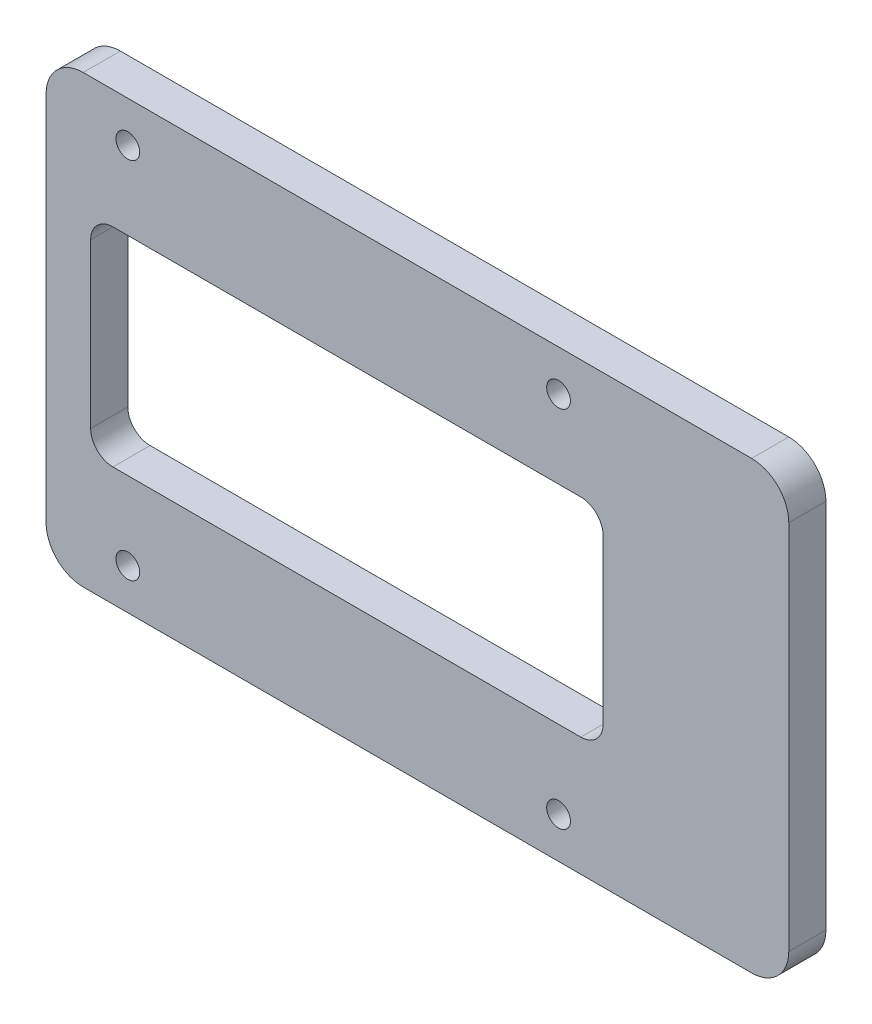
ISO-10303-21;
HEADER;
FILE_DESCRIPTION(('STEP AP214'),'2;1');
FILE_NAME('part.step','',(''),(''),'','','');
FILE_SCHEMA(('AUTOMOTIVE_DESIGN { 1 0 10303 214 1 1 1 1 }'));
ENDSEC;
DATA;
#1=APPLICATION_CONTEXT('core data for automotive mechanical design processes');
#2=APPLICATION_PROTOCOL_DEFINITION('international standard','automotive_design',2000,#1);
#3=PRODUCT_CONTEXT('',#1,'mechanical');
#4=PRODUCT('Part','Part','',(#3));
#5=PRODUCT_RELATED_PRODUCT_CATEGORY('part','',(#4));
#6=PRODUCT_DEFINITION_FORMATION('','',#4);
#7=PRODUCT_DEFINITION_CONTEXT('part definition',#1,'design');
#8=PRODUCT_DEFINITION('design','',#6,#7);
#9=PRODUCT_DEFINITION_SHAPE('','',#8);
#10=(LENGTH_UNIT() NAMED_UNIT(*) SI_UNIT(.MILLI.,.METRE.));
#11=(NAMED_UNIT(*) PLANE_ANGLE_UNIT() SI_UNIT($,.RADIAN.));
#12=(NAMED_UNIT(*) SI_UNIT($,.STERADIAN.) SOLID_ANGLE_UNIT());
#13=UNCERTAINTY_MEASURE_WITH_UNIT(LENGTH_MEASURE(1.E-05),#10,'distance_accuracy_value','');
#14=(GEOMETRIC_REPRESENTATION_CONTEXT(3) GLOBAL_UNCERTAINTY_ASSIGNED_CONTEXT((#13)) GLOBAL_UNIT_ASSIGNED_CONTEXT((#10,
#11,#12)) REPRESENTATION_CONTEXT('',''));
#15=CARTESIAN_POINT('',(0.,0.,0.));
#16=DIRECTION('',(0.,0.,1.));
#17=DIRECTION('',(1.,0.,0.));
#18=AXIS2_PLACEMENT_3D('',#15,#16,#17);
#19=CARTESIAN_POINT('',(-45.,-25.,5.));
#20=DIRECTION('',(0.,0.,1.));
#21=DIRECTION('',(1.,0.,0.));
#22=AXIS2_PLACEMENT_3D('',#19,#20,#21);
#23=PLANE('',#22);
#24=CARTESIAN_POINT('',(-39.,-24.5,5.));
#25=DIRECTION('',(0.,0.,1.));
#26=DIRECTION('',(1.,0.,0.));
#27=AXIS2_PLACEMENT_3D('',#24,#25,#26);
#28=CIRCLE('',#27,1.6);
#29=CARTESIAN_POINT('',(-37.4,-24.5,5.));
#30=VERTEX_POINT('',#29);
#31=EDGE_CURVE('E253',#30,#30,#28,.T.);
#32=ORIENTED_EDGE('',*,*,#31,.F.);
#33=EDGE_LOOP('',(#32));
#34=FACE_BOUND('',#33,.T.);
#35=CARTESIAN_POINT('',(19.,24.5,5.));
#36=DIRECTION('',(0.,0.,1.));
#37=DIRECTION('',(1.,0.,0.));
#38=AXIS2_PLACEMENT_3D('',#35,#36,#37);
#39=CIRCLE('',#38,1.6);
#40=CARTESIAN_POINT('',(20.6,24.5,5.));
#41=VERTEX_POINT('',#40);
#42=EDGE_CURVE('E269',#41,#41,#39,.T.);
#43=ORIENTED_EDGE('',*,*,#42,.F.);
#44=EDGE_LOOP('',(#43));
#45=FACE_BOUND('',#44,.T.);
#46=CARTESIAN_POINT('',(-45.,-25.,5.));
#47=DIRECTION('',(0.,0.,1.));
#48=DIRECTION('',(1.,0.,0.));
#49=AXIS2_PLACEMENT_3D('',#46,#47,#48);
#50=CIRCLE('',#49,5.);
#51=CARTESIAN_POINT('',(-50.,-25.,5.));
#52=VERTEX_POINT('',#51);
#53=CARTESIAN_POINT('',(-45.,-30.,5.));
#54=VERTEX_POINT('',#53);
#55=EDGE_CURVE('E277',#52,#54,#50,.T.);
#56=ORIENTED_EDGE('',*,*,#55,.T.);
#57=DIRECTION('',(1.,0.,0.));
#58=VECTOR('',#57,1.);
#59=CARTESIAN_POINT('',(-45.,-30.,5.));
#60=LINE('',#59,#58);
#61=CARTESIAN_POINT('',(45.,-30.,5.));
#62=VERTEX_POINT('',#61);
#63=EDGE_CURVE('E281',#54,#62,#60,.T.);
#64=ORIENTED_EDGE('',*,*,#63,.T.);
#65=CARTESIAN_POINT('',(45.,-25.,5.));
#66=DIRECTION('',(0.,0.,1.));
#67=DIRECTION('',(1.,0.,0.));
#68=AXIS2_PLACEMENT_3D('',#65,#66,#67);
#69=CIRCLE('',#68,5.);
#70=CARTESIAN_POINT('',(50.,-25.,5.));
#71=VERTEX_POINT('',#70);
#72=EDGE_CURVE('E285',#62,#71,#69,.T.);
#73=ORIENTED_EDGE('',*,*,#72,.T.);
#74=DIRECTION('',(0.,1.,0.));
#75=VECTOR('',#74,1.);
#76=CARTESIAN_POINT('',(50.,25.,5.));
#77=LINE('',#76,#75);
#78=CARTESIAN_POINT('',(50.,25.,5.));
#79=VERTEX_POINT('',#78);
#80=EDGE_CURVE('E288',#71,#79,#77,.T.);
#81=ORIENTED_EDGE('',*,*,#80,.T.);
#82=CARTESIAN_POINT('',(45.,25.,5.));
#83=DIRECTION('',(0.,0.,1.));
#84=DIRECTION('',(-1.,0.,0.));
#85=AXIS2_PLACEMENT_3D('',#82,#83,#84);
#86=CIRCLE('',#85,5.);
#87=CARTESIAN_POINT('',(45.,30.,5.));
#88=VERTEX_POINT('',#87);
#89=EDGE_CURVE('E291',#79,#88,#86,.T.);
#90=ORIENTED_EDGE('',*,*,#89,.T.);
#91=DIRECTION('',(-1.,0.,0.));
#92=VECTOR('',#91,1.);
#93=CARTESIAN_POINT('',(-45.,30.,5.));
#94=LINE('',#93,#92);
#95=CARTESIAN_POINT('',(-45.,30.,5.));
#96=VERTEX_POINT('',#95);
#97=EDGE_CURVE('E294',#88,#96,#94,.T.);
#98=ORIENTED_EDGE('',*,*,#97,.T.);
#99=CARTESIAN_POINT('',(-45.,25.,5.));
#100=DIRECTION('',(0.,0.,1.));
#101=DIRECTION('',(1.,0.,0.));
#102=AXIS2_PLACEMENT_3D('',#99,#100,#101);
#103=CIRCLE('',#102,5.);
#104=CARTESIAN_POINT('',(-50.,25.,5.));
#105=VERTEX_POINT('',#104);
#106=EDGE_CURVE('E297',#96,#105,#103,.T.);
#107=ORIENTED_EDGE('',*,*,#106,.T.);
#108=DIRECTION('',(0.,-1.,0.));
#109=VECTOR('',#108,1.);
#110=CARTESIAN_POINT('',(-50.,25.,5.));
#111=LINE('',#110,#109);
#112=EDGE_CURVE('E300',#105,#52,#111,.T.);
#113=ORIENTED_EDGE('',*,*,#112,.T.);
#114=EDGE_LOOP('',(#56,#64,#73,#81,#90,#98,#107,#113));
#115=FACE_BOUND('',#114,.T.);
#116=CARTESIAN_POINT('',(19.,-24.5,5.));
#117=DIRECTION('',(0.,0.,1.));
#118=DIRECTION('',(1.,0.,0.));
#119=AXIS2_PLACEMENT_3D('',#116,#117,#118);
#120=CIRCLE('',#119,1.6);
#121=CARTESIAN_POINT('',(20.6,-24.5,5.));
#122=VERTEX_POINT('',#121);
#123=EDGE_CURVE('E261',#122,#122,#120,.T.);
#124=ORIENTED_EDGE('',*,*,#123,.F.);
#125=EDGE_LOOP('',(#124));
#126=FACE_BOUND('',#125,.T.);
#127=CARTESIAN_POINT('',(-39.,24.5,5.));
#128=DIRECTION('',(0.,0.,1.));
#129=DIRECTION('',(1.,0.,0.));
#130=AXIS2_PLACEMENT_3D('',#127,#128,#129);
#131=CIRCLE('',#130,1.6);
#132=CARTESIAN_POINT('',(-37.4,24.5,5.));
#133=VERTEX_POINT('',#132);
#134=EDGE_CURVE('E245',#133,#133,#131,.T.);
#135=ORIENTED_EDGE('',*,*,#134,.F.);
#136=EDGE_LOOP('',(#135));
#137=FACE_BOUND('',#136,.T.);
#138=DIRECTION('',(0.,1.,0.));
#139=VECTOR('',#138,1.);
#140=CARTESIAN_POINT('',(25.,11.,5.));
#141=LINE('',#140,#139);
#142=CARTESIAN_POINT('',(25.,-11.,5.));
#143=VERTEX_POINT('',#142);
#144=CARTESIAN_POINT('',(25.,11.,5.));
#145=VERTEX_POINT('',#144);
#146=EDGE_CURVE('E165',#143,#145,#141,.T.);
#147=ORIENTED_EDGE('',*,*,#146,.F.);
#148=CARTESIAN_POINT('',(22.,-11.,5.));
#149=DIRECTION('',(0.,0.,1.));
#150=DIRECTION('',(1.,0.,0.));
#151=AXIS2_PLACEMENT_3D('',#148,#149,#150);
#152=CIRCLE('',#151,3.);
#153=CARTESIAN_POINT('',(22.,-14.,5.));
#154=VERTEX_POINT('',#153);
#155=EDGE_CURVE('E156',#154,#143,#152,.T.);
#156=ORIENTED_EDGE('',*,*,#155,.F.);
#157=DIRECTION('',(1.,0.,0.));
#158=VECTOR('',#157,1.);
#159=CARTESIAN_POINT('',(-41.,-14.,5.));
#160=LINE('',#159,#158);
#161=CARTESIAN_POINT('',(-41.,-14.,5.));
#162=VERTEX_POINT('',#161);
#163=EDGE_CURVE('E197',#162,#154,#160,.T.);
#164=ORIENTED_EDGE('',*,*,#163,.F.);
#165=CARTESIAN_POINT('',(-41.,-11.,5.));
#166=DIRECTION('',(0.,0.,1.));
#167=DIRECTION('',(1.,0.,0.));
#168=AXIS2_PLACEMENT_3D('',#165,#166,#167);
#169=CIRCLE('',#168,3.);
#170=CARTESIAN_POINT('',(-44.,-11.,5.));
#171=VERTEX_POINT('',#170);
#172=EDGE_CURVE('E194',#171,#162,#169,.T.);
#173=ORIENTED_EDGE('',*,*,#172,.F.);
#174=DIRECTION('',(0.,-1.,0.));
#175=VECTOR('',#174,1.);
#176=CARTESIAN_POINT('',(-44.,11.,5.));
#177=LINE('',#176,#175);
#178=CARTESIAN_POINT('',(-44.,11.,5.));
#179=VERTEX_POINT('',#178);
#180=EDGE_CURVE('E191',#179,#171,#177,.T.);
#181=ORIENTED_EDGE('',*,*,#180,.F.);
#182=CARTESIAN_POINT('',(-41.,11.,5.));
#183=DIRECTION('',(0.,0.,1.));
#184=DIRECTION('',(1.,0.,0.));
#185=AXIS2_PLACEMENT_3D('',#182,#183,#184);
#186=CIRCLE('',#185,3.);
#187=CARTESIAN_POINT('',(-41.,14.,5.));
#188=VERTEX_POINT('',#187);
#189=EDGE_CURVE('E188',#188,#179,#186,.T.);
#190=ORIENTED_EDGE('',*,*,#189,.F.);
#191=DIRECTION('',(-1.,0.,0.));
#192=VECTOR('',#191,1.);
#193=CARTESIAN_POINT('',(-41.,14.,5.));
#194=LINE('',#193,#192);
#195=CARTESIAN_POINT('',(22.,14.,5.));
#196=VERTEX_POINT('',#195);
#197=EDGE_CURVE('E183',#196,#188,#194,.T.);
#198=ORIENTED_EDGE('',*,*,#197,.F.);
#199=CARTESIAN_POINT('',(22.,11.,5.));
#200=DIRECTION('',(0.,0.,1.));
#201=DIRECTION('',(-1.,0.,0.));
#202=AXIS2_PLACEMENT_3D('',#199,#200,#201);
#203=CIRCLE('',#202,3.);
#204=EDGE_CURVE('E179',#145,#196,#203,.T.);
#205=ORIENTED_EDGE('',*,*,#204,.F.);
#206=EDGE_LOOP('',(#147,#156,#164,#173,#181,#190,#198,#205));
#207=FACE_BOUND('',#206,.T.);
#208=ADVANCED_FACE('F42',(#34,#45,#115,#126,#137,#207),#23,.T.);
#209=CARTESIAN_POINT('',(-45.,-25.,0.));
#210=DIRECTION('',(0.,0.,1.));
#211=DIRECTION('',(1.,0.,0.));
#212=AXIS2_PLACEMENT_3D('',#209,#210,#211);
#213=PLANE('',#212);
#214=CARTESIAN_POINT('',(-39.,24.5,0.));
#215=DIRECTION('',(0.,0.,1.));
#216=DIRECTION('',(1.,0.,0.));
#217=AXIS2_PLACEMENT_3D('',#214,#215,#216);
#218=CIRCLE('',#217,1.6);
#219=CARTESIAN_POINT('',(-37.4,24.5,0.));
#220=VERTEX_POINT('',#219);
#221=EDGE_CURVE('E174',#220,#220,#218,.T.);
#222=ORIENTED_EDGE('',*,*,#221,.T.);
#223=EDGE_LOOP('',(#222));
#224=FACE_BOUND('',#223,.T.);
#225=CARTESIAN_POINT('',(-39.,-24.5,0.));
#226=DIRECTION('',(0.,0.,1.));
#227=DIRECTION('',(1.,0.,0.));
#228=AXIS2_PLACEMENT_3D('',#225,#226,#227);
#229=CIRCLE('',#228,1.6);
#230=CARTESIAN_POINT('',(-37.4,-24.5,0.));
#231=VERTEX_POINT('',#230);
#232=EDGE_CURVE('E249',#231,#231,#229,.T.);
#233=ORIENTED_EDGE('',*,*,#232,.T.);
#234=EDGE_LOOP('',(#233));
#235=FACE_BOUND('',#234,.T.);
#236=CARTESIAN_POINT('',(19.,-24.5,0.));
#237=DIRECTION('',(0.,0.,1.));
#238=DIRECTION('',(1.,0.,0.));
#239=AXIS2_PLACEMENT_3D('',#236,#237,#238);
#240=CIRCLE('',#239,1.6);
#241=CARTESIAN_POINT('',(20.6,-24.5,0.));
#242=VERTEX_POINT('',#241);
#243=EDGE_CURVE('E257',#242,#242,#240,.T.);
#244=ORIENTED_EDGE('',*,*,#243,.T.);
#245=EDGE_LOOP('',(#244));
#246=FACE_BOUND('',#245,.T.);
#247=CARTESIAN_POINT('',(19.,24.5,0.));
#248=DIRECTION('',(0.,0.,1.));
#249=DIRECTION('',(1.,0.,0.));
#250=AXIS2_PLACEMENT_3D('',#247,#248,#249);
#251=CIRCLE('',#250,1.6);
#252=CARTESIAN_POINT('',(20.6,24.5,0.));
#253=VERTEX_POINT('',#252);
#254=EDGE_CURVE('E265',#253,#253,#251,.T.);
#255=ORIENTED_EDGE('',*,*,#254,.T.);
#256=EDGE_LOOP('',(#255));
#257=FACE_BOUND('',#256,.T.);
#258=CARTESIAN_POINT('',(-45.,-25.,0.));
#259=DIRECTION('',(0.,0.,1.));
#260=DIRECTION('',(1.,0.,0.));
#261=AXIS2_PLACEMENT_3D('',#258,#259,#260);
#262=CIRCLE('',#261,5.);
#263=CARTESIAN_POINT('',(-50.,-25.,0.));
#264=VERTEX_POINT('',#263);
#265=CARTESIAN_POINT('',(-45.,-30.,0.));
#266=VERTEX_POINT('',#265);
#267=EDGE_CURVE('E273',#264,#266,#262,.T.);
#268=ORIENTED_EDGE('',*,*,#267,.F.);
#269=DIRECTION('',(0.,-1.,0.));
#270=VECTOR('',#269,1.);
#271=CARTESIAN_POINT('',(-50.,25.,0.));
#272=LINE('',#271,#270);
#273=CARTESIAN_POINT('',(-50.,25.,0.));
#274=VERTEX_POINT('',#273);
#275=EDGE_CURVE('E282',#274,#264,#272,.T.);
#276=ORIENTED_EDGE('',*,*,#275,.F.);
#277=CARTESIAN_POINT('',(-45.,25.,0.));
#278=DIRECTION('',(0.,0.,1.));
#279=DIRECTION('',(1.,0.,0.));
#280=AXIS2_PLACEMENT_3D('',#277,#278,#279);
#281=CIRCLE('',#280,5.);
#282=CARTESIAN_POINT('',(-45.,30.,0.));
#283=VERTEX_POINT('',#282);
#284=EDGE_CURVE('E322',#283,#274,#281,.T.);
#285=ORIENTED_EDGE('',*,*,#284,.F.);
#286=DIRECTION('',(-1.,0.,0.));
#287=VECTOR('',#286,1.);
#288=CARTESIAN_POINT('',(-45.,30.,0.));
#289=LINE('',#288,#287);
#290=CARTESIAN_POINT('',(45.,30.,0.));
#291=VERTEX_POINT('',#290);
#292=EDGE_CURVE('E319',#291,#283,#289,.T.);
#293=ORIENTED_EDGE('',*,*,#292,.F.);
#294=CARTESIAN_POINT('',(45.,25.,0.));
#295=DIRECTION('',(0.,0.,1.));
#296=DIRECTION('',(-1.,0.,0.));
#297=AXIS2_PLACEMENT_3D('',#294,#295,#296);
#298=CIRCLE('',#297,5.);
#299=CARTESIAN_POINT('',(50.,25.,0.));
#300=VERTEX_POINT('',#299);
#301=EDGE_CURVE('E316',#300,#291,#298,.T.);
#302=ORIENTED_EDGE('',*,*,#301,.F.);
#303=DIRECTION('',(0.,1.,0.));
#304=VECTOR('',#303,1.);
#305=CARTESIAN_POINT('',(50.,25.,0.));
#306=LINE('',#305,#304);
#307=CARTESIAN_POINT('',(50.,-25.,0.));
#308=VERTEX_POINT('',#307);
#309=EDGE_CURVE('E313',#308,#300,#306,.T.);
#310=ORIENTED_EDGE('',*,*,#309,.F.);
#311=CARTESIAN_POINT('',(45.,-25.,0.));
#312=DIRECTION('',(0.,0.,1.));
#313=DIRECTION('',(1.,0.,0.));
#314=AXIS2_PLACEMENT_3D('',#311,#312,#313);
#315=CIRCLE('',#314,5.);
#316=CARTESIAN_POINT('',(45.,-30.,0.));
#317=VERTEX_POINT('',#316);
#318=EDGE_CURVE('E310',#317,#308,#315,.T.);
#319=ORIENTED_EDGE('',*,*,#318,.F.);
#320=DIRECTION('',(1.,0.,0.));
#321=VECTOR('',#320,1.);
#322=CARTESIAN_POINT('',(-45.,-30.,0.));
#323=LINE('',#322,#321);
#324=EDGE_CURVE('E307',#266,#317,#323,.T.);
#325=ORIENTED_EDGE('',*,*,#324,.F.);
#326=EDGE_LOOP('',(#268,#276,#285,#293,#302,#310,#319,#325));
#327=FACE_BOUND('',#326,.T.);
#328=CARTESIAN_POINT('',(22.,-11.,0.));
#329=DIRECTION('',(0.,0.,1.));
#330=DIRECTION('',(1.,0.,0.));
#331=AXIS2_PLACEMENT_3D('',#328,#329,#330);
#332=CIRCLE('',#331,3.);
#333=CARTESIAN_POINT('',(22.,-14.,0.));
#334=VERTEX_POINT('',#333);
#335=CARTESIAN_POINT('',(25.,-11.,0.));
#336=VERTEX_POINT('',#335);
#337=EDGE_CURVE('E66',#334,#336,#332,.T.);
#338=ORIENTED_EDGE('',*,*,#337,.T.);
#339=DIRECTION('',(0.,1.,0.));
#340=VECTOR('',#339,1.);
#341=CARTESIAN_POINT('',(25.,11.,0.));
#342=LINE('',#341,#340);
#343=CARTESIAN_POINT('',(25.,11.,0.));
#344=VERTEX_POINT('',#343);
#345=EDGE_CURVE('E172',#336,#344,#342,.T.);
#346=ORIENTED_EDGE('',*,*,#345,.T.);
#347=CARTESIAN_POINT('',(22.,11.,0.));
#348=DIRECTION('',(0.,0.,1.));
#349=DIRECTION('',(-1.,0.,0.));
#350=AXIS2_PLACEMENT_3D('',#347,#348,#349);
#351=CIRCLE('',#350,3.);
#352=CARTESIAN_POINT('',(22.,14.,0.));
#353=VERTEX_POINT('',#352);
#354=EDGE_CURVE('E204',#344,#353,#351,.T.);
#355=ORIENTED_EDGE('',*,*,#354,.T.);
#356=DIRECTION('',(-1.,0.,0.));
#357=VECTOR('',#356,1.);
#358=CARTESIAN_POINT('',(-41.,14.,0.));
#359=LINE('',#358,#357);
#360=CARTESIAN_POINT('',(-41.,14.,0.));
#361=VERTEX_POINT('',#360);
#362=EDGE_CURVE('E208',#353,#361,#359,.T.);
#363=ORIENTED_EDGE('',*,*,#362,.T.);
#364=CARTESIAN_POINT('',(-41.,11.,0.));
#365=DIRECTION('',(0.,0.,1.));
#366=DIRECTION('',(1.,0.,0.));
#367=AXIS2_PLACEMENT_3D('',#364,#365,#366);
#368=CIRCLE('',#367,3.);
#369=CARTESIAN_POINT('',(-44.,11.,0.));
#370=VERTEX_POINT('',#369);
#371=EDGE_CURVE('E212',#361,#370,#368,.T.);
#372=ORIENTED_EDGE('',*,*,#371,.T.);
#373=DIRECTION('',(0.,-1.,0.));
#374=VECTOR('',#373,1.);
#375=CARTESIAN_POINT('',(-44.,11.,0.));
#376=LINE('',#375,#374);
#377=CARTESIAN_POINT('',(-44.,-11.,0.));
#378=VERTEX_POINT('',#377);
#379=EDGE_CURVE('E216',#370,#378,#376,.T.);
#380=ORIENTED_EDGE('',*,*,#379,.T.);
#381=CARTESIAN_POINT('',(-41.,-11.,0.));
#382=DIRECTION('',(0.,0.,1.));
#383=DIRECTION('',(1.,0.,0.));
#384=AXIS2_PLACEMENT_3D('',#381,#382,#383);
#385=CIRCLE('',#384,3.);
#386=CARTESIAN_POINT('',(-41.,-14.,0.));
#387=VERTEX_POINT('',#386);
#388=EDGE_CURVE('E220',#378,#387,#385,.T.);
#389=ORIENTED_EDGE('',*,*,#388,.T.);
#390=DIRECTION('',(1.,0.,0.));
#391=VECTOR('',#390,1.);
#392=CARTESIAN_POINT('',(-41.,-14.,0.));
#393=LINE('',#392,#391);
#394=EDGE_CURVE('E166',#387,#334,#393,.T.);
#395=ORIENTED_EDGE('',*,*,#394,.T.);
#396=EDGE_LOOP('',(#338,#346,#355,#363,#372,#380,#389,#395));
#397=FACE_BOUND('',#396,.T.);
#398=ADVANCED_FACE('F361',(#224,#235,#246,#257,#327,#397),#213,.F.);
#399=CARTESIAN_POINT('',(-45.,-25.,5.));
#400=DIRECTION('',(0.,0.,-1.));
#401=DIRECTION('',(-1.,0.,0.));
#402=AXIS2_PLACEMENT_3D('',#399,#400,#401);
#403=CYLINDRICAL_SURFACE('',#402,5.);
#404=ORIENTED_EDGE('',*,*,#267,.T.);
#405=DIRECTION('',(0.,0.,-1.));
#406=VECTOR('',#405,1.);
#407=CARTESIAN_POINT('',(-45.,-30.,5.));
#408=LINE('',#407,#406);
#409=EDGE_CURVE('E11',#54,#266,#408,.T.);
#410=ORIENTED_EDGE('',*,*,#409,.F.);
#411=ORIENTED_EDGE('',*,*,#55,.F.);
#412=DIRECTION('',(0.,0.,-1.));
#413=VECTOR('',#412,1.);
#414=CARTESIAN_POINT('',(-50.,-25.,5.));
#415=LINE('',#414,#413);
#416=EDGE_CURVE('E303',#52,#264,#415,.T.);
#417=ORIENTED_EDGE('',*,*,#416,.T.);
#418=EDGE_LOOP('',(#404,#410,#411,#417));
#419=FACE_BOUND('',#418,.T.);
#420=ADVANCED_FACE('F44',(#419),#403,.T.);
#421=CARTESIAN_POINT('',(-45.,-30.,5.));
#422=DIRECTION('',(0.,1.,0.));
#423=DIRECTION('',(0.,0.,1.));
#424=AXIS2_PLACEMENT_3D('',#421,#422,#423);
#425=PLANE('',#424);
#426=ORIENTED_EDGE('',*,*,#324,.T.);
#427=DIRECTION('',(0.,0.,-1.));
#428=VECTOR('',#427,1.);
#429=CARTESIAN_POINT('',(45.,-30.,5.));
#430=LINE('',#429,#428);
#431=EDGE_CURVE('E51',#62,#317,#430,.T.);
#432=ORIENTED_EDGE('',*,*,#431,.F.);
#433=ORIENTED_EDGE('',*,*,#63,.F.);
#434=ORIENTED_EDGE('',*,*,#409,.T.);
#435=EDGE_LOOP('',(#426,#432,#433,#434));
#436=FACE_BOUND('',#435,.T.);
#437=ADVANCED_FACE('F379',(#436),#425,.F.);
#438=CARTESIAN_POINT('',(45.,-25.,5.));
#439=DIRECTION('',(0.,0.,-1.));
#440=DIRECTION('',(-1.,0.,0.));
#441=AXIS2_PLACEMENT_3D('',#438,#439,#440);
#442=CYLINDRICAL_SURFACE('',#441,5.);
#443=ORIENTED_EDGE('',*,*,#318,.T.);
#444=DIRECTION('',(0.,0.,-1.));
#445=VECTOR('',#444,1.);
#446=CARTESIAN_POINT('',(50.,-25.,5.));
#447=LINE('',#446,#445);
#448=EDGE_CURVE('E346',#71,#308,#447,.T.);
#449=ORIENTED_EDGE('',*,*,#448,.F.);
#450=ORIENTED_EDGE('',*,*,#72,.F.);
#451=ORIENTED_EDGE('',*,*,#431,.T.);
#452=EDGE_LOOP('',(#443,#449,#450,#451));
#453=FACE_BOUND('',#452,.T.);
#454=ADVANCED_FACE('F355',(#453),#442,.T.);
#455=CARTESIAN_POINT('',(50.,25.,5.));
#456=DIRECTION('',(-1.,0.,0.));
#457=DIRECTION('',(0.,0.,1.));
#458=AXIS2_PLACEMENT_3D('',#455,#456,#457);
#459=PLANE('',#458);
#460=ORIENTED_EDGE('',*,*,#309,.T.);
#461=DIRECTION('',(0.,0.,-1.));
#462=VECTOR('',#461,1.);
#463=CARTESIAN_POINT('',(50.,25.,5.));
#464=LINE('',#463,#462);
#465=EDGE_CURVE('E342',#79,#300,#464,.T.);
#466=ORIENTED_EDGE('',*,*,#465,.F.);
#467=ORIENTED_EDGE('',*,*,#80,.F.);
#468=ORIENTED_EDGE('',*,*,#448,.T.);
#469=EDGE_LOOP('',(#460,#466,#467,#468));
#470=FACE_BOUND('',#469,.T.);
#471=ADVANCED_FACE('F367',(#470),#459,.F.);
#472=CARTESIAN_POINT('',(45.,25.,5.));
#473=DIRECTION('',(0.,0.,-1.));
#474=DIRECTION('',(-1.,0.,0.));
#475=AXIS2_PLACEMENT_3D('',#472,#473,#474);
#476=CYLINDRICAL_SURFACE('',#475,5.);
#477=ORIENTED_EDGE('',*,*,#301,.T.);
#478=DIRECTION('',(0.,0.,-1.));
#479=VECTOR('',#478,1.);
#480=CARTESIAN_POINT('',(45.,30.,5.));
#481=LINE('',#480,#479);
#482=EDGE_CURVE('E338',#88,#291,#481,.T.);
#483=ORIENTED_EDGE('',*,*,#482,.F.);
#484=ORIENTED_EDGE('',*,*,#89,.F.);
#485=ORIENTED_EDGE('',*,*,#465,.T.);
#486=EDGE_LOOP('',(#477,#483,#484,#485));
#487=FACE_BOUND('',#486,.T.);
#488=ADVANCED_FACE('F371',(#487),#476,.T.);
#489=CARTESIAN_POINT('',(-45.,30.,5.));
#490=DIRECTION('',(0.,-1.,0.));
#491=DIRECTION('',(0.,0.,-1.));
#492=AXIS2_PLACEMENT_3D('',#489,#490,#491);
#493=PLANE('',#492);
#494=ORIENTED_EDGE('',*,*,#292,.T.);
#495=DIRECTION('',(0.,0.,-1.));
#496=VECTOR('',#495,1.);
#497=CARTESIAN_POINT('',(-45.,30.,5.));
#498=LINE('',#497,#496);
#499=EDGE_CURVE('E334',#96,#283,#498,.T.);
#500=ORIENTED_EDGE('',*,*,#499,.F.);
#501=ORIENTED_EDGE('',*,*,#97,.F.);
#502=ORIENTED_EDGE('',*,*,#482,.T.);
#503=EDGE_LOOP('',(#494,#500,#501,#502));
#504=FACE_BOUND('',#503,.T.);
#505=ADVANCED_FACE('F392',(#504),#493,.F.);
#506=CARTESIAN_POINT('',(-45.,25.,5.));
#507=DIRECTION('',(0.,0.,-1.));
#508=DIRECTION('',(-1.,0.,0.));
#509=AXIS2_PLACEMENT_3D('',#506,#507,#508);
#510=CYLINDRICAL_SURFACE('',#509,5.);
#511=ORIENTED_EDGE('',*,*,#284,.T.);
#512=DIRECTION('',(0.,0.,-1.));
#513=VECTOR('',#512,1.);
#514=CARTESIAN_POINT('',(-50.,25.,5.));
#515=LINE('',#514,#513);
#516=EDGE_CURVE('E330',#105,#274,#515,.T.);
#517=ORIENTED_EDGE('',*,*,#516,.F.);
#518=ORIENTED_EDGE('',*,*,#106,.F.);
#519=ORIENTED_EDGE('',*,*,#499,.T.);
#520=EDGE_LOOP('',(#511,#517,#518,#519));
#521=FACE_BOUND('',#520,.T.);
#522=ADVANCED_FACE('F390',(#521),#510,.T.);
#523=CARTESIAN_POINT('',(-50.,25.,5.));
#524=DIRECTION('',(1.,0.,0.));
#525=DIRECTION('',(0.,0.,-1.));
#526=AXIS2_PLACEMENT_3D('',#523,#524,#525);
#527=PLANE('',#526);
#528=ORIENTED_EDGE('',*,*,#275,.T.);
#529=ORIENTED_EDGE('',*,*,#416,.F.);
#530=ORIENTED_EDGE('',*,*,#112,.F.);
#531=ORIENTED_EDGE('',*,*,#516,.T.);
#532=EDGE_LOOP('',(#528,#529,#530,#531));
#533=FACE_BOUND('',#532,.T.);
#534=ADVANCED_FACE('F385',(#533),#527,.F.);
#535=CARTESIAN_POINT('',(19.,24.5,5.));
#536=DIRECTION('',(0.,0.,-1.));
#537=DIRECTION('',(-1.,0.,0.));
#538=AXIS2_PLACEMENT_3D('',#535,#536,#537);
#539=CYLINDRICAL_SURFACE('',#538,1.6);
#540=ORIENTED_EDGE('',*,*,#42,.T.);
#541=EDGE_LOOP('',(#540));
#542=FACE_BOUND('',#541,.T.);
#543=ORIENTED_EDGE('',*,*,#254,.F.);
#544=EDGE_LOOP('',(#543));
#545=FACE_BOUND('',#544,.T.);
#546=ADVANCED_FACE('F412',(#542,#545),#539,.F.);
#547=CARTESIAN_POINT('',(19.,-24.5,5.));
#548=DIRECTION('',(0.,0.,-1.));
#549=DIRECTION('',(-1.,0.,0.));
#550=AXIS2_PLACEMENT_3D('',#547,#548,#549);
#551=CYLINDRICAL_SURFACE('',#550,1.6);
#552=ORIENTED_EDGE('',*,*,#123,.T.);
#553=EDGE_LOOP('',(#552));
#554=FACE_BOUND('',#553,.T.);
#555=ORIENTED_EDGE('',*,*,#243,.F.);
#556=EDGE_LOOP('',(#555));
#557=FACE_BOUND('',#556,.T.);
#558=ADVANCED_FACE('F419',(#554,#557),#551,.F.);
#559=CARTESIAN_POINT('',(-39.,-24.5,5.));
#560=DIRECTION('',(0.,0.,-1.));
#561=DIRECTION('',(-1.,0.,0.));
#562=AXIS2_PLACEMENT_3D('',#559,#560,#561);
#563=CYLINDRICAL_SURFACE('',#562,1.6);
#564=ORIENTED_EDGE('',*,*,#31,.T.);
#565=EDGE_LOOP('',(#564));
#566=FACE_BOUND('',#565,.T.);
#567=ORIENTED_EDGE('',*,*,#232,.F.);
#568=EDGE_LOOP('',(#567));
#569=FACE_BOUND('',#568,.T.);
#570=ADVANCED_FACE('F424',(#566,#569),#563,.F.);
#571=CARTESIAN_POINT('',(-39.,24.5,5.));
#572=DIRECTION('',(0.,0.,-1.));
#573=DIRECTION('',(-1.,0.,0.));
#574=AXIS2_PLACEMENT_3D('',#571,#572,#573);
#575=CYLINDRICAL_SURFACE('',#574,1.6);
#576=ORIENTED_EDGE('',*,*,#134,.T.);
#577=EDGE_LOOP('',(#576));
#578=FACE_BOUND('',#577,.T.);
#579=ORIENTED_EDGE('',*,*,#221,.F.);
#580=EDGE_LOOP('',(#579));
#581=FACE_BOUND('',#580,.T.);
#582=ADVANCED_FACE('F433',(#578,#581),#575,.F.);
#583=CARTESIAN_POINT('',(22.,-11.,5.));
#584=DIRECTION('',(0.,0.,-1.));
#585=DIRECTION('',(-1.,0.,0.));
#586=AXIS2_PLACEMENT_3D('',#583,#584,#585);
#587=CYLINDRICAL_SURFACE('',#586,3.);
#588=ORIENTED_EDGE('',*,*,#337,.F.);
#589=DIRECTION('',(0.,0.,-1.));
#590=VECTOR('',#589,1.);
#591=CARTESIAN_POINT('',(22.,-14.,5.));
#592=LINE('',#591,#590);
#593=EDGE_CURVE('E160',#154,#334,#592,.T.);
#594=ORIENTED_EDGE('',*,*,#593,.F.);
#595=ORIENTED_EDGE('',*,*,#155,.T.);
#596=DIRECTION('',(0.,0.,-1.));
#597=VECTOR('',#596,1.);
#598=CARTESIAN_POINT('',(25.,-11.,5.));
#599=LINE('',#598,#597);
#600=EDGE_CURVE('E159',#143,#336,#599,.T.);
#601=ORIENTED_EDGE('',*,*,#600,.T.);
#602=EDGE_LOOP('',(#588,#594,#595,#601));
#603=FACE_BOUND('',#602,.T.);
#604=ADVANCED_FACE('F158',(#603),#587,.F.);
#605=CARTESIAN_POINT('',(25.,11.,5.));
#606=DIRECTION('',(-1.,0.,0.));
#607=DIRECTION('',(0.,-1.,0.));
#608=AXIS2_PLACEMENT_3D('',#605,#606,#607);
#609=PLANE('',#608);
#610=ORIENTED_EDGE('',*,*,#345,.F.);
#611=ORIENTED_EDGE('',*,*,#600,.F.);
#612=ORIENTED_EDGE('',*,*,#146,.T.);
#613=DIRECTION('',(0.,0.,-1.));
#614=VECTOR('',#613,1.);
#615=CARTESIAN_POINT('',(25.,11.,5.));
#616=LINE('',#615,#614);
#617=EDGE_CURVE('E175',#145,#344,#616,.T.);
#618=ORIENTED_EDGE('',*,*,#617,.T.);
#619=EDGE_LOOP('',(#610,#611,#612,#618));
#620=FACE_BOUND('',#619,.T.);
#621=ADVANCED_FACE('F169',(#620),#609,.T.);
#622=CARTESIAN_POINT('',(22.,11.,5.));
#623=DIRECTION('',(0.,0.,-1.));
#624=DIRECTION('',(-1.,0.,0.));
#625=AXIS2_PLACEMENT_3D('',#622,#623,#624);
#626=CYLINDRICAL_SURFACE('',#625,3.);
#627=ORIENTED_EDGE('',*,*,#354,.F.);
#628=ORIENTED_EDGE('',*,*,#617,.F.);
#629=ORIENTED_EDGE('',*,*,#204,.T.);
#630=DIRECTION('',(0.,0.,-1.));
#631=VECTOR('',#630,1.);
#632=CARTESIAN_POINT('',(22.,14.,5.));
#633=LINE('',#632,#631);
#634=EDGE_CURVE('E240',#196,#353,#633,.T.);
#635=ORIENTED_EDGE('',*,*,#634,.T.);
#636=EDGE_LOOP('',(#627,#628,#629,#635));
#637=FACE_BOUND('',#636,.T.);
#638=ADVANCED_FACE('F445',(#637),#626,.F.);
#639=CARTESIAN_POINT('',(-41.,14.,5.));
#640=DIRECTION('',(0.,-1.,0.));
#641=DIRECTION('',(0.,0.,-1.));
#642=AXIS2_PLACEMENT_3D('',#639,#640,#641);
#643=PLANE('',#642);
#644=ORIENTED_EDGE('',*,*,#362,.F.);
#645=ORIENTED_EDGE('',*,*,#634,.F.);
#646=ORIENTED_EDGE('',*,*,#197,.T.);
#647=DIRECTION('',(0.,0.,-1.));
#648=VECTOR('',#647,1.);
#649=CARTESIAN_POINT('',(-41.,14.,5.));
#650=LINE('',#649,#648);
#651=EDGE_CURVE('E237',#188,#361,#650,.T.);
#652=ORIENTED_EDGE('',*,*,#651,.T.);
#653=EDGE_LOOP('',(#644,#645,#646,#652));
#654=FACE_BOUND('',#653,.T.);
#655=ADVANCED_FACE('F448',(#654),#643,.T.);
#656=CARTESIAN_POINT('',(-41.,11.,5.));
#657=DIRECTION('',(0.,0.,-1.));
#658=DIRECTION('',(-1.,0.,0.));
#659=AXIS2_PLACEMENT_3D('',#656,#657,#658);
#660=CYLINDRICAL_SURFACE('',#659,3.);
#661=ORIENTED_EDGE('',*,*,#371,.F.);
#662=ORIENTED_EDGE('',*,*,#651,.F.);
#663=ORIENTED_EDGE('',*,*,#189,.T.);
#664=DIRECTION('',(0.,0.,-1.));
#665=VECTOR('',#664,1.);
#666=CARTESIAN_POINT('',(-44.,11.,5.));
#667=LINE('',#666,#665);
#668=EDGE_CURVE('E234',#179,#370,#667,.T.);
#669=ORIENTED_EDGE('',*,*,#668,.T.);
#670=EDGE_LOOP('',(#661,#662,#663,#669));
#671=FACE_BOUND('',#670,.T.);
#672=ADVANCED_FACE('F452',(#671),#660,.F.);
#673=CARTESIAN_POINT('',(-44.,11.,5.));
#674=DIRECTION('',(1.,0.,0.));
#675=DIRECTION('',(0.,0.,-1.));
#676=AXIS2_PLACEMENT_3D('',#673,#674,#675);
#677=PLANE('',#676);
#678=ORIENTED_EDGE('',*,*,#379,.F.);
#679=ORIENTED_EDGE('',*,*,#668,.F.);
#680=ORIENTED_EDGE('',*,*,#180,.T.);
#681=DIRECTION('',(0.,0.,-1.));
#682=VECTOR('',#681,1.);
#683=CARTESIAN_POINT('',(-44.,-11.,5.));
#684=LINE('',#683,#682);
#685=EDGE_CURVE('E231',#171,#378,#684,.T.);
#686=ORIENTED_EDGE('',*,*,#685,.T.);
#687=EDGE_LOOP('',(#678,#679,#680,#686));
#688=FACE_BOUND('',#687,.T.);
#689=ADVANCED_FACE('F456',(#688),#677,.T.);
#690=CARTESIAN_POINT('',(-41.,-11.,5.));
#691=DIRECTION('',(0.,0.,-1.));
#692=DIRECTION('',(-1.,0.,0.));
#693=AXIS2_PLACEMENT_3D('',#690,#691,#692);
#694=CYLINDRICAL_SURFACE('',#693,3.);
#695=ORIENTED_EDGE('',*,*,#388,.F.);
#696=ORIENTED_EDGE('',*,*,#685,.F.);
#697=ORIENTED_EDGE('',*,*,#172,.T.);
#698=DIRECTION('',(0.,0.,-1.));
#699=VECTOR('',#698,1.);
#700=CARTESIAN_POINT('',(-41.,-14.,5.));
#701=LINE('',#700,#699);
#702=EDGE_CURVE('E58',#162,#387,#701,.T.);
#703=ORIENTED_EDGE('',*,*,#702,.T.);
#704=EDGE_LOOP('',(#695,#696,#697,#703));
#705=FACE_BOUND('',#704,.T.);
#706=ADVANCED_FACE('F460',(#705),#694,.F.);
#707=CARTESIAN_POINT('',(-41.,-14.,5.));
#708=DIRECTION('',(0.,1.,0.));
#709=DIRECTION('',(0.,0.,1.));
#710=AXIS2_PLACEMENT_3D('',#707,#708,#709);
#711=PLANE('',#710);
#712=ORIENTED_EDGE('',*,*,#394,.F.);
#713=ORIENTED_EDGE('',*,*,#702,.F.);
#714=ORIENTED_EDGE('',*,*,#163,.T.);
#715=ORIENTED_EDGE('',*,*,#593,.T.);
#716=EDGE_LOOP('',(#712,#713,#714,#715));
#717=FACE_BOUND('',#716,.T.);
#718=ADVANCED_FACE('F464',(#717),#711,.T.);
#719=CLOSED_SHELL('',(#208,#398,#420,#437,#454,#471,#488,#505,#522,#534,#546,#558,#570,#582,
#604,#621,#638,#655,#672,#689,#706,#718));
#720=MANIFOLD_SOLID_BREP('B2',#719);
#721=ADVANCED_BREP_SHAPE_REPRESENTATION('',(#18,#720),#14);
#722=SHAPE_DEFINITION_REPRESENTATION(#9,#721);
ENDSEC;
END-ISO-10303-21;
